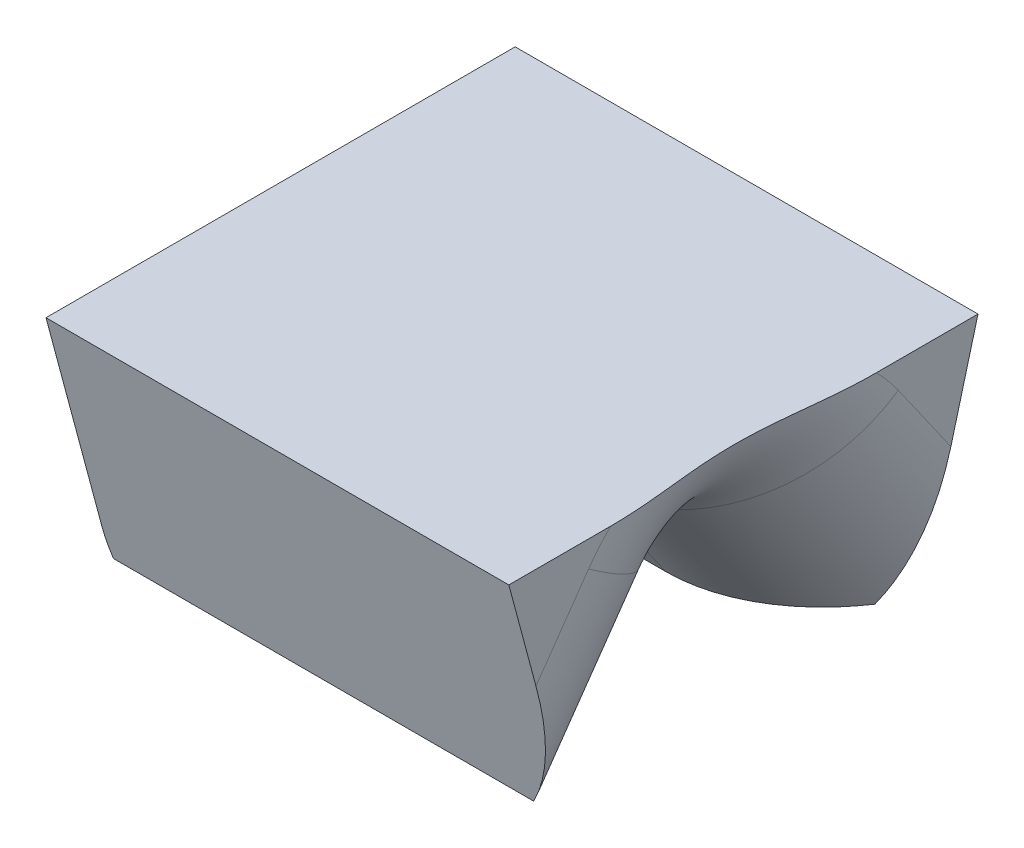
ISO-10303-21;
HEADER;
FILE_DESCRIPTION(('STEP AP214'),'2;1');
FILE_NAME('part.step','',(''),(''),'','','');
FILE_SCHEMA(('AUTOMOTIVE_DESIGN { 1 0 10303 214 1 1 1 1 }'));
ENDSEC;
DATA;
#1=APPLICATION_CONTEXT('core data for automotive mechanical design processes');
#2=APPLICATION_PROTOCOL_DEFINITION('international standard','automotive_design',2000,#1);
#3=PRODUCT_CONTEXT('',#1,'mechanical');
#4=PRODUCT('Part','Part','',(#3));
#5=PRODUCT_RELATED_PRODUCT_CATEGORY('part','',(#4));
#6=PRODUCT_DEFINITION_FORMATION('','',#4);
#7=PRODUCT_DEFINITION_CONTEXT('part definition',#1,'design');
#8=PRODUCT_DEFINITION('design','',#6,#7);
#9=PRODUCT_DEFINITION_SHAPE('','',#8);
#10=(LENGTH_UNIT() NAMED_UNIT(*) SI_UNIT(.MILLI.,.METRE.));
#11=(NAMED_UNIT(*) PLANE_ANGLE_UNIT() SI_UNIT($,.RADIAN.));
#12=(NAMED_UNIT(*) SI_UNIT($,.STERADIAN.) SOLID_ANGLE_UNIT());
#13=UNCERTAINTY_MEASURE_WITH_UNIT(LENGTH_MEASURE(1.E-05),#10,'distance_accuracy_value','');
#14=(GEOMETRIC_REPRESENTATION_CONTEXT(3) GLOBAL_UNCERTAINTY_ASSIGNED_CONTEXT((#13)) GLOBAL_UNIT_ASSIGNED_CONTEXT((#10,
#11,#12)) REPRESENTATION_CONTEXT('',''));
#15=CARTESIAN_POINT('',(0.,0.,0.));
#16=DIRECTION('',(0.,0.,1.));
#17=DIRECTION('',(1.,0.,0.));
#18=AXIS2_PLACEMENT_3D('',#15,#16,#17);
#19=CARTESIAN_POINT('',(0.,0.27922650273224,0.));
#20=DIRECTION('',(0.,1.,0.));
#21=DIRECTION('',(0.,0.,1.));
#22=AXIS2_PLACEMENT_3D('',#19,#20,#21);
#23=PLANE('',#22);
#24=DIRECTION('',(0.,0.,-1.));
#25=VECTOR('',#24,1.);
#26=CARTESIAN_POINT('',(-0.26924,0.27922650273224,1.4986));
#27=LINE('',#26,#25);
#28=CARTESIAN_POINT('',(-0.26924,0.27922650273224,0.274208515912471));
#29=VERTEX_POINT('',#28);
#30=CARTESIAN_POINT('',(-0.26924,0.27922650273224,-0.274208515912471));
#31=VERTEX_POINT('',#30);
#32=EDGE_CURVE('E327',#29,#31,#27,.T.);
#33=ORIENTED_EDGE('',*,*,#32,.F.);
#34=DIRECTION('',(-1.,0.,0.));
#35=VECTOR('',#34,1.);
#36=CARTESIAN_POINT('',(1.4986,0.27922650273224,0.274208515912471));
#37=LINE('',#36,#35);
#38=CARTESIAN_POINT('',(0.27178,0.27922650273224,0.274208515912471));
#39=VERTEX_POINT('',#38);
#40=EDGE_CURVE('E148',#39,#29,#37,.T.);
#41=ORIENTED_EDGE('',*,*,#40,.F.);
#42=DIRECTION('',(0.,0.,1.));
#43=VECTOR('',#42,1.);
#44=CARTESIAN_POINT('',(0.27178,0.27922650273224,1.4986));
#45=LINE('',#44,#43);
#46=CARTESIAN_POINT('',(0.27178,0.27922650273224,0.155199306049195));
#47=VERTEX_POINT('',#46);
#48=EDGE_CURVE('E58',#47,#39,#45,.T.);
#49=ORIENTED_EDGE('',*,*,#48,.F.);
#50=CARTESIAN_POINT('',(0.261409572351437,0.27922650273224,0.));
#51=CARTESIAN_POINT('',(0.261411930949183,0.27922650273224,0.0134753644819062));
#52=CARTESIAN_POINT('',(0.262027307295171,0.27922650273224,0.0269505145516935));
#53=CARTESIAN_POINT('',(0.264057567430298,0.27922650273224,0.0538534476202388));
#54=CARTESIAN_POINT('',(0.265474106116057,0.27922650273224,0.0672810744988983));
#55=CARTESIAN_POINT('',(0.268240338738278,0.27922650273224,0.0941487064279613));
#56=CARTESIAN_POINT('',(0.269590011099996,0.27922650273224,0.107588714066585));
#57=CARTESIAN_POINT('',(0.271441531605455,0.27922650273224,0.134512755613001));
#58=CARTESIAN_POINT('',(0.27194515694217,0.27922650273224,0.147996637471236));
#59=CARTESIAN_POINT('',(0.271503832959947,0.27922650273224,0.175721675900549));
#60=CARTESIAN_POINT('',(0.270475650819152,0.27922650273224,0.189962685952789));
#61=CARTESIAN_POINT('',(0.266325341418143,0.27922650273224,0.218151310804776));
#62=CARTESIAN_POINT('',(0.263204202100015,0.27922650273224,0.232099060830347));
#63=CARTESIAN_POINT('',(0.254536947856463,0.27922650273224,0.259414949987794));
#64=CARTESIAN_POINT('',(0.248963643916857,0.27922650273224,0.272774687998595));
#65=CARTESIAN_POINT('',(0.235314978842799,0.27922650273224,0.298162295281189));
#66=CARTESIAN_POINT('',(0.227240952722872,0.27922650273224,0.310190870556834));
#67=CARTESIAN_POINT('',(0.20993544907511,0.27922650273224,0.330895602184589));
#68=CARTESIAN_POINT('',(0.200981041006737,0.27922650273224,0.33980349266405));
#69=CARTESIAN_POINT('',(0.181539173886592,0.27922650273224,0.355751681174934));
#70=CARTESIAN_POINT('',(0.17105278481687,0.27922650273224,0.362793273104145));
#71=CARTESIAN_POINT('',(0.150166130211165,0.27922650273224,0.374010337046365));
#72=CARTESIAN_POINT('',(0.139891251488478,0.27922650273224,0.378420442747476));
#73=CARTESIAN_POINT('',(0.118724705510833,0.27922650273224,0.385355795227373));
#74=CARTESIAN_POINT('',(0.107833287617908,0.27922650273224,0.387881798262052));
#75=CARTESIAN_POINT('',(0.0862991296442801,0.27922650273224,0.390879748600226));
#76=CARTESIAN_POINT('',(0.075669039191837,0.27922650273224,0.391443305344718));
#77=CARTESIAN_POINT('',(0.0544687943929551,0.27922650273224,0.390753614920567));
#78=CARTESIAN_POINT('',(0.0438986319720614,0.27922650273224,0.389500618642163));
#79=CARTESIAN_POINT('',(0.0232516610462377,0.27922650273224,0.38524877198694));
#80=CARTESIAN_POINT('',(0.0131704011658055,0.27922650273224,0.382271450737142));
#81=CARTESIAN_POINT('',(-0.00636021819474013,0.27922650273224,0.374689363480222));
#82=CARTESIAN_POINT('',(-0.0158095000652034,0.27922650273224,0.37008439802612));
#83=CARTESIAN_POINT('',(-0.0339634800100927,0.27922650273224,0.359321713112478));
#84=CARTESIAN_POINT('',(-0.0426553071947941,0.27922650273224,0.353142324836664));
#85=CARTESIAN_POINT('',(-0.0589282425524156,0.27922650273224,0.339471053681931));
#86=CARTESIAN_POINT('',(-0.0665096354686949,0.27922650273224,0.331979508358927));
#87=CARTESIAN_POINT('',(-0.0807221919951382,0.27922650273224,0.31556142869167));
#88=CARTESIAN_POINT('',(-0.0872972457378956,0.27922650273224,0.306586440270441));
#89=CARTESIAN_POINT('',(-0.0989936649155186,0.27922650273224,0.287725201647558));
#90=CARTESIAN_POINT('',(-0.104113100837212,0.27922650273224,0.277837764708165));
#91=CARTESIAN_POINT('',(-0.113270204453259,0.27922650273224,0.256510438792003));
#92=CARTESIAN_POINT('',(-0.117168319195871,0.27922650273224,0.245011001006073));
#93=CARTESIAN_POINT('',(-0.12329254639139,0.27922650273224,0.221616753734351));
#94=CARTESIAN_POINT('',(-0.125522593207607,0.27922650273224,0.209722944133195));
#95=CARTESIAN_POINT('',(-0.129210284685769,0.27922650273224,0.180221206875491));
#96=CARTESIAN_POINT('',(-0.129834648420498,0.27922650273224,0.162512840460841));
#97=CARTESIAN_POINT('',(-0.129201469472564,0.27922650273224,0.135996767573505));
#98=CARTESIAN_POINT('',(-0.128725778663324,0.27922650273224,0.127144864414392));
#99=CARTESIAN_POINT('',(-0.127436113338908,0.27922650273224,0.109457033119701));
#100=CARTESIAN_POINT('',(-0.126621850882479,0.27922650273224,0.100621125026812));
#101=CARTESIAN_POINT('',(-0.124231375169854,0.27922650273224,0.0766042755949413));
#102=CARTESIAN_POINT('',(-0.122528834928036,0.27922650273224,0.0614379912442762));
#103=CARTESIAN_POINT('',(-0.120009195350884,0.27922650273224,0.0310530532246932));
#104=CARTESIAN_POINT('',(-0.119189571194242,0.27922650273224,0.0158346744015781));
#105=CARTESIAN_POINT('',(-0.119150360222816,0.27922650273224,-0.0146185128984737));
#106=CARTESIAN_POINT('',(-0.119932210971695,0.27922650273224,-0.029853323856607));
#107=CARTESIAN_POINT('',(-0.122409653985377,0.27922650273224,-0.0602703505226533));
#108=CARTESIAN_POINT('',(-0.124107948176397,0.27922650273224,-0.0754522764227972));
#109=CARTESIAN_POINT('',(-0.126608765883377,0.27922650273224,-0.10043719682521));
#110=CARTESIAN_POINT('',(-0.127514768409142,0.27922650273224,-0.110227874280489));
#111=CARTESIAN_POINT('',(-0.128894532085198,0.27922650273224,-0.129828761198234));
#112=CARTESIAN_POINT('',(-0.12936870673535,0.27922650273224,-0.13963894294179));
#113=CARTESIAN_POINT('',(-0.1297618775454,0.27922650273224,-0.168986125065657));
#114=CARTESIAN_POINT('',(-0.128672257039444,0.27922650273224,-0.188574929182217));
#115=CARTESIAN_POINT('',(-0.123487929944756,0.27922650273224,-0.220851759632217));
#116=CARTESIAN_POINT('',(-0.12048708496115,0.27922650273224,-0.233710139941791));
#117=CARTESIAN_POINT('',(-0.112444004684893,0.27922650273224,-0.258838884143882));
#118=CARTESIAN_POINT('',(-0.107394503560604,0.27922650273224,-0.271106979447686));
#119=CARTESIAN_POINT('',(-0.0951516806642721,0.27922650273224,-0.294636339464564));
#120=CARTESIAN_POINT('',(-0.0879447575358083,0.27922650273224,-0.305890608824321));
#121=CARTESIAN_POINT('',(-0.0715185428454595,0.27922650273224,-0.326800706223305));
#122=CARTESIAN_POINT('',(-0.0623031553416292,0.27922650273224,-0.336459572258379));
#123=CARTESIAN_POINT('',(-0.0432823795095371,0.27922650273224,-0.352749771517368));
#124=CARTESIAN_POINT('',(-0.0336649299595167,0.27922650273224,-0.359600996185923));
#125=CARTESIAN_POINT('',(-0.0133360672015722,0.27922650273224,-0.37143432797485));
#126=CARTESIAN_POINT('',(-0.00262473267847953,0.27922650273224,-0.376416569413755));
#127=CARTESIAN_POINT('',(0.0186753189022551,0.27922650273224,-0.383994619891665));
#128=CARTESIAN_POINT('',(0.0292090941962937,0.27922650273224,-0.386745567894979));
#129=CARTESIAN_POINT('',(0.0505921742493299,0.27922650273224,-0.390378315144707));
#130=CARTESIAN_POINT('',(0.0614413582505349,0.27922650273224,-0.391260820435553));
#131=CARTESIAN_POINT('',(0.0827981393330838,0.27922650273224,-0.391127595715074));
#132=CARTESIAN_POINT('',(0.0933061408666186,0.27922650273224,-0.390168484876454));
#133=CARTESIAN_POINT('',(0.114011017765888,0.27922650273224,-0.386497343057953));
#134=CARTESIAN_POINT('',(0.124207894552834,0.27922650273224,-0.383785320086601));
#135=CARTESIAN_POINT('',(0.143998981119113,0.27922650273224,-0.376704422285208));
#136=CARTESIAN_POINT('',(0.153593639498437,0.27922650273224,-0.372336798224142));
#137=CARTESIAN_POINT('',(0.17193706242015,0.27922650273224,-0.362091834024821));
#138=CARTESIAN_POINT('',(0.180685840069873,0.27922650273224,-0.356214517285149));
#139=CARTESIAN_POINT('',(0.197344387536552,0.27922650273224,-0.342969775419285));
#140=CARTESIAN_POINT('',(0.205226543648451,0.27922650273224,-0.335567685622365));
#141=CARTESIAN_POINT('',(0.219720673187446,0.27922650273224,-0.319610374962858));
#142=CARTESIAN_POINT('',(0.226332159408797,0.27922650273224,-0.3110547139239));
#143=CARTESIAN_POINT('',(0.238543396900728,0.27922650273224,-0.292500444172474));
#144=CARTESIAN_POINT('',(0.244057895640052,0.27922650273224,-0.282445888419424));
#145=CARTESIAN_POINT('',(0.253515115936898,0.27922650273224,-0.261638305410444));
#146=CARTESIAN_POINT('',(0.257458503153779,0.27922650273224,-0.250885576211995));
#147=CARTESIAN_POINT('',(0.265267128069491,0.27922650273224,-0.224021519997242));
#148=CARTESIAN_POINT('',(0.26830462447627,0.27922650273224,-0.207669169287877));
#149=CARTESIAN_POINT('',(0.271716061109982,0.27922650273224,-0.174670700789146));
#150=CARTESIAN_POINT('',(0.272078934355691,0.27922650273224,-0.158023647795927));
#151=CARTESIAN_POINT('',(0.271185334490767,0.27922650273224,-0.129577259993204));
#152=CARTESIAN_POINT('',(0.2703629567588,0.27922650273224,-0.117755275791181));
#153=CARTESIAN_POINT('',(0.268277633349044,0.27922650273224,-0.0941386140481303));
#154=CARTESIAN_POINT('',(0.267014098880695,0.27922650273224,-0.0823439943129568));
#155=CARTESIAN_POINT('',(0.264613296440676,0.27922650273224,-0.0588048320739451));
#156=CARTESIAN_POINT('',(0.263475382335501,0.27922650273224,-0.0470603638673561));
#157=CARTESIAN_POINT('',(0.261873271464089,0.27922650273224,-0.0235437905292073));
#158=CARTESIAN_POINT('',(0.261407511926821,0.27922650273224,-0.0117718134510921));
#159=CARTESIAN_POINT('',(0.261409572351437,0.27922650273224,0.));
#160=B_SPLINE_CURVE_WITH_KNOTS('',3,(#50,#51,#52,#53,#54,#55,#56,#57,#58,#59,#60,#61,#62,#63,
#64,#65,#66,#67,#68,#69,#70,#71,#72,#73,#74,#75,#76,#77,#78,#79,#80,#81,#82,#83,#84,#85,#86,#87,
#88,#89,#90,#91,#92,#93,#94,#95,#96,#97,#98,#99,#100,#101,#102,#103,#104,#105,#106,#107,#108,
#109,#110,#111,#112,#113,#114,#115,#116,#117,#118,#119,#120,#121,#122,#123,#124,#125,#126,#127,
#128,#129,#130,#131,#132,#133,#134,#135,#136,#137,#138,#139,#140,#141,#142,#143,#144,#145,#146,
#147,#148,#149,#150,#151,#152,#153,#154,#155,#156,#157,#158,#159),.UNSPECIFIED.,.T.,.F.,(4,2,2,
2,2,2,2,2,2,2,2,2,2,2,2,2,2,2,2,2,2,2,2,2,2,2,2,2,2,2,2,2,2,2,2,2,2,2,2,2,2,2,2,2,2,2,2,2,2,2,2,
2,2,2,4),(0.,0.0404210036662082,0.080925808297917,0.1214435980047,0.161876169768269,
0.204587290655132,0.247278264718459,0.290455007532691,0.333608739988325,0.371284004450668,
0.408933080059908,0.442307778834236,0.475669074190757,0.50745046849923,0.539227473790726,
0.570616026664885,0.60200842713893,0.633858718476046,0.665700828242473,0.698936544832523,
0.73221611422796,0.768502900810188,0.804703827865885,0.857635218077114,0.884227474136462,
0.910842392222406,0.956630669317037,1.00228765800492,1.04798564864093,1.09381911150299,
1.12330957086767,1.15277176164969,1.21128802125955,1.25075313427605,1.29035945647933,
1.33022093051515,1.37000560199431,1.40524130201511,1.44047446926057,1.4729745544678,
1.5054623563963,1.53696731246435,1.56847212459674,1.59995318284348,1.6314337531977,
1.66373002682763,1.69603865903733,1.73029916057309,1.7645451309075,1.81414539800468,
1.8639507850931,1.89948911304643,1.93507505475263,1.97046847240188,2.00577946642385),.UNSPECIFIED.);
#161=CARTESIAN_POINT('',(0.27178,0.27922650273224,-0.155199306049195));
#162=VERTEX_POINT('',#161);
#163=EDGE_CURVE('E12',#162,#47,#160,.T.);
#164=ORIENTED_EDGE('',*,*,#163,.F.);
#165=CARTESIAN_POINT('',(0.27178,0.27922650273224,-0.274208515912471));
#166=VERTEX_POINT('',#165);
#167=EDGE_CURVE('E135',#166,#162,#45,.T.);
#168=ORIENTED_EDGE('',*,*,#167,.F.);
#169=DIRECTION('',(1.,0.,0.));
#170=VECTOR('',#169,1.);
#171=CARTESIAN_POINT('',(1.4986,0.27922650273224,-0.274208515912471));
#172=LINE('',#171,#170);
#173=EDGE_CURVE('E330',#31,#166,#172,.T.);
#174=ORIENTED_EDGE('',*,*,#173,.F.);
#175=EDGE_LOOP('',(#33,#41,#49,#164,#168,#174));
#176=FACE_BOUND('',#175,.T.);
#177=ADVANCED_FACE('F39',(#176),#23,.T.);
#178=CARTESIAN_POINT('',(1.4986,0.,-0.19939));
#179=DIRECTION('',(0.,-0.258819045102522,-0.965925826289068));
#180=DIRECTION('',(0.,0.965925826289068,-0.258819045102522));
#181=AXIS2_PLACEMENT_3D('',#178,#179,#180);
#182=PLANE('',#181);
#183=DIRECTION('',(0.,0.965925826289068,-0.258819045102522));
#184=VECTOR('',#183,1.);
#185=CARTESIAN_POINT('',(-0.26924,0.,-0.19939));
#186=LINE('',#185,#184);
#187=CARTESIAN_POINT('',(-0.26924,0.035961265173748,-0.209025791962107));
#188=VERTEX_POINT('',#187);
#189=EDGE_CURVE('E257',#188,#31,#186,.T.);
#190=ORIENTED_EDGE('',*,*,#189,.T.);
#191=ORIENTED_EDGE('',*,*,#173,.T.);
#192=DIRECTION('',(0.,-0.965925826289068,0.258819045102522));
#193=VECTOR('',#192,1.);
#194=CARTESIAN_POINT('',(0.27178,0.,-0.19939));
#195=LINE('',#194,#193);
#196=CARTESIAN_POINT('',(0.27178,0.160868655615237,-0.242494626359583));
#197=VERTEX_POINT('',#196);
#198=EDGE_CURVE('E147',#166,#197,#195,.T.);
#199=ORIENTED_EDGE('',*,*,#198,.T.);
#200=CARTESIAN_POINT('',(0.07112,0.160868655615237,-0.242494626359583));
#201=DIRECTION('',(0.,-0.258819045102522,-0.965925826289068));
#202=DIRECTION('',(0.,-0.965925826289068,0.258819045102522));
#203=AXIS2_PLACEMENT_3D('',#200,#201,#202);
#204=ELLIPSE('',#203,0.261943026677416,0.20066);
#205=CARTESIAN_POINT('',(0.226000122767599,0.,-0.19939));
#206=VERTEX_POINT('',#205);
#207=EDGE_CURVE('E65',#197,#206,#204,.T.);
#208=ORIENTED_EDGE('',*,*,#207,.T.);
#209=DIRECTION('',(-1.,0.,0.));
#210=VECTOR('',#209,1.);
#211=CARTESIAN_POINT('',(1.4986,0.,-0.19939));
#212=LINE('',#211,#210);
#213=CARTESIAN_POINT('',(-0.265155055093439,0.,-0.19939));
#214=VERTEX_POINT('',#213);
#215=EDGE_CURVE('E262',#206,#214,#212,.T.);
#216=ORIENTED_EDGE('',*,*,#215,.T.);
#217=CARTESIAN_POINT('',(-0.16764,0.035961265173748,-0.209025791962107));
#218=DIRECTION('',(0.,-0.258819045102522,-0.965925826289068));
#219=DIRECTION('',(0.,0.965925826289068,-0.258819045102522));
#220=AXIS2_PLACEMENT_3D('',#217,#218,#219);
#221=ELLIPSE('',#220,0.13262938059616,0.1016);
#222=EDGE_CURVE('E301',#214,#188,#221,.T.);
#223=ORIENTED_EDGE('',*,*,#222,.T.);
#224=EDGE_LOOP('',(#190,#191,#199,#208,#216,#223));
#225=FACE_BOUND('',#224,.T.);
#226=ADVANCED_FACE('F199',(#225),#182,.T.);
#227=CARTESIAN_POINT('',(1.4986,0.,0.19939));
#228=DIRECTION('',(0.,-0.258819045102522,0.965925826289068));
#229=DIRECTION('',(0.,-0.965925826289068,-0.258819045102522));
#230=AXIS2_PLACEMENT_3D('',#227,#228,#229);
#231=PLANE('',#230);
#232=DIRECTION('',(0.,0.965925826289068,0.258819045102522));
#233=VECTOR('',#232,1.);
#234=CARTESIAN_POINT('',(0.27178,0.,0.19939));
#235=LINE('',#234,#233);
#236=CARTESIAN_POINT('',(0.27178,0.160868655615237,0.242494626359583));
#237=VERTEX_POINT('',#236);
#238=EDGE_CURVE('E247',#237,#39,#235,.T.);
#239=ORIENTED_EDGE('',*,*,#238,.T.);
#240=ORIENTED_EDGE('',*,*,#40,.T.);
#241=DIRECTION('',(0.,-0.965925826289068,-0.258819045102522));
#242=VECTOR('',#241,1.);
#243=CARTESIAN_POINT('',(-0.26924,0.,0.19939));
#244=LINE('',#243,#242);
#245=CARTESIAN_POINT('',(-0.26924,0.035961265173748,0.209025791962107));
#246=VERTEX_POINT('',#245);
#247=EDGE_CURVE('E263',#29,#246,#244,.T.);
#248=ORIENTED_EDGE('',*,*,#247,.T.);
#249=CARTESIAN_POINT('',(-0.16764,0.035961265173748,0.209025791962107));
#250=DIRECTION('',(0.,-0.258819045102522,0.965925826289068));
#251=DIRECTION('',(0.,-0.965925826289068,-0.258819045102522));
#252=AXIS2_PLACEMENT_3D('',#249,#250,#251);
#253=ELLIPSE('',#252,0.13262938059616,0.1016);
#254=CARTESIAN_POINT('',(-0.265155055093439,0.,0.19939));
#255=VERTEX_POINT('',#254);
#256=EDGE_CURVE('E287',#246,#255,#253,.T.);
#257=ORIENTED_EDGE('',*,*,#256,.T.);
#258=DIRECTION('',(-1.,0.,0.));
#259=VECTOR('',#258,1.);
#260=CARTESIAN_POINT('',(1.4986,0.,0.19939));
#261=LINE('',#260,#259);
#262=CARTESIAN_POINT('',(0.226000122767599,0.,0.19939));
#263=VERTEX_POINT('',#262);
#264=EDGE_CURVE('E260',#263,#255,#261,.T.);
#265=ORIENTED_EDGE('',*,*,#264,.F.);
#266=CARTESIAN_POINT('',(0.07112,0.160868655615237,0.242494626359583));
#267=DIRECTION('',(0.,-0.258819045102522,0.965925826289068));
#268=DIRECTION('',(0.,0.965925826289068,0.258819045102522));
#269=AXIS2_PLACEMENT_3D('',#266,#267,#268);
#270=ELLIPSE('',#269,0.261943026677416,0.20066);
#271=EDGE_CURVE('E159',#263,#237,#270,.T.);
#272=ORIENTED_EDGE('',*,*,#271,.T.);
#273=EDGE_LOOP('',(#239,#240,#248,#257,#265,#272));
#274=FACE_BOUND('',#273,.T.);
#275=ADVANCED_FACE('F231',(#274),#231,.T.);
#276=CARTESIAN_POINT('',(-0.26924,0.82312002,1.4986));
#277=DIRECTION('',(-1.,0.,0.));
#278=DIRECTION('',(0.,-1.,0.));
#279=AXIS2_PLACEMENT_3D('',#276,#277,#278);
#280=PLANE('',#279);
#281=ORIENTED_EDGE('',*,*,#247,.F.);
#282=ORIENTED_EDGE('',*,*,#32,.T.);
#283=ORIENTED_EDGE('',*,*,#189,.F.);
#284=DIRECTION('',(0.,-0.819152044288993,-0.573576436351044));
#285=VECTOR('',#284,1.);
#286=CARTESIAN_POINT('',(-0.26924,0.191850439119919,-0.0998710172397141));
#287=LINE('',#286,#285);
#288=CARTESIAN_POINT('',(-0.26924,0.191850439119919,-0.0998710172397141));
#289=VERTEX_POINT('',#288);
#290=EDGE_CURVE('E273',#188,#289,#287,.F.);
#291=ORIENTED_EDGE('',*,*,#290,.T.);
#292=CARTESIAN_POINT('',(-0.26924,0.12192,0.));
#293=DIRECTION('',(-1.,0.,0.));
#294=DIRECTION('',(0.,-1.,0.));
#295=AXIS2_PLACEMENT_3D('',#292,#293,#294);
#296=CIRCLE('',#295,0.12192);
#297=CARTESIAN_POINT('',(-0.26924,0.191850439119919,0.0998710172397142));
#298=VERTEX_POINT('',#297);
#299=EDGE_CURVE('E279',#289,#298,#296,.F.);
#300=ORIENTED_EDGE('',*,*,#299,.T.);
#301=DIRECTION('',(0.,0.819152044288994,-0.573576436351044));
#302=VECTOR('',#301,1.);
#303=CARTESIAN_POINT('',(-0.26924,0.0582753659332659,0.193401290401922));
#304=LINE('',#303,#302);
#305=EDGE_CURVE('E285',#298,#246,#304,.F.);
#306=ORIENTED_EDGE('',*,*,#305,.T.);
#307=EDGE_LOOP('',(#281,#282,#283,#291,#300,#306));
#308=FACE_BOUND('',#307,.T.);
#309=ADVANCED_FACE('F352',(#308),#280,.T.);
#310=CARTESIAN_POINT('',(0.27178,-0.00999998,1.4986));
#311=DIRECTION('',(1.,0.,0.));
#312=DIRECTION('',(0.,0.,-1.));
#313=AXIS2_PLACEMENT_3D('',#310,#311,#312);
#314=PLANE('',#313);
#315=ORIENTED_EDGE('',*,*,#198,.F.);
#316=ORIENTED_EDGE('',*,*,#167,.T.);
#317=CARTESIAN_POINT('',(0.27178,0.12192,0.));
#318=DIRECTION('',(1.,0.,0.));
#319=DIRECTION('',(0.,0.,-1.));
#320=AXIS2_PLACEMENT_3D('',#317,#318,#319);
#321=CIRCLE('',#320,0.22098);
#322=CARTESIAN_POINT('',(0.27178,0.248668920904854,-0.181016218746982));
#323=VERTEX_POINT('',#322);
#324=EDGE_CURVE('E145',#162,#323,#321,.F.);
#325=ORIENTED_EDGE('',*,*,#324,.T.);
#326=DIRECTION('',(0.,0.819152044288994,0.573576436351044));
#327=VECTOR('',#326,1.);
#328=CARTESIAN_POINT('',(0.27178,0.1150938477182,-0.274546491909189));
#329=LINE('',#328,#327);
#330=EDGE_CURVE('E156',#323,#197,#329,.F.);
#331=ORIENTED_EDGE('',*,*,#330,.T.);
#332=EDGE_LOOP('',(#315,#316,#325,#331));
#333=FACE_BOUND('',#332,.T.);
#334=ADVANCED_FACE('F143',(#333),#314,.T.);
#335=CARTESIAN_POINT('',(0.27178,0.248668920904854,0.181016218746982));
#336=VERTEX_POINT('',#335);
#337=EDGE_CURVE('E155',#336,#47,#321,.F.);
#338=ORIENTED_EDGE('',*,*,#337,.T.);
#339=ORIENTED_EDGE('',*,*,#48,.T.);
#340=ORIENTED_EDGE('',*,*,#238,.F.);
#341=DIRECTION('',(0.,-0.819152044288994,0.573576436351043));
#342=VECTOR('',#341,1.);
#343=CARTESIAN_POINT('',(0.27178,0.248668920904853,0.181016218746982));
#344=LINE('',#343,#342);
#345=EDGE_CURVE('E158',#237,#336,#344,.F.);
#346=ORIENTED_EDGE('',*,*,#345,.T.);
#347=EDGE_LOOP('',(#338,#339,#340,#346));
#348=FACE_BOUND('',#347,.T.);
#349=ADVANCED_FACE('F220',(#348),#314,.T.);
#350=CARTESIAN_POINT('',(0.07112,0.12192,0.));
#351=DIRECTION('',(1.,0.,0.));
#352=DIRECTION('',(0.,0.,-1.));
#353=AXIS2_PLACEMENT_3D('',#350,#351,#352);
#354=TOROIDAL_SURFACE('',#353,0.22098,0.20066);
#355=ORIENTED_EDGE('',*,*,#324,.F.);
#356=ORIENTED_EDGE('',*,*,#163,.T.);
#357=ORIENTED_EDGE('',*,*,#337,.F.);
#358=CARTESIAN_POINT('',(0.0711200000000007,0.248668920904854,0.181016218746982));
#359=DIRECTION('',(0.,-0.819152044288993,0.573576436351045));
#360=DIRECTION('',(0.,-0.573576436351045,-0.819152044288993));
#361=AXIS2_PLACEMENT_3D('',#358,#359,#360);
#362=CIRCLE('',#361,0.20066);
#363=CARTESIAN_POINT('',(0.0711200000000007,0.133575073186653,0.0166451695399524));
#364=VERTEX_POINT('',#363);
#365=EDGE_CURVE('E326',#364,#336,#362,.T.);
#366=ORIENTED_EDGE('',*,*,#365,.F.);
#367=CARTESIAN_POINT('',(0.0711200000000007,0.12192,0.));
#368=DIRECTION('',(1.,0.,0.));
#369=DIRECTION('',(0.,0.,-1.));
#370=AXIS2_PLACEMENT_3D('',#367,#368,#369);
#371=CIRCLE('',#370,0.0203200000000001);
#372=CARTESIAN_POINT('',(0.07112,0.133575073186653,-0.0166451695399524));
#373=VERTEX_POINT('',#372);
#374=EDGE_CURVE('E164',#373,#364,#371,.T.);
#375=ORIENTED_EDGE('',*,*,#374,.F.);
#376=CARTESIAN_POINT('',(0.07112,0.248668920904854,-0.181016218746982));
#377=DIRECTION('',(0.,0.819152044288993,0.573576436351044));
#378=DIRECTION('',(0.,-0.573576436351044,0.819152044288993));
#379=AXIS2_PLACEMENT_3D('',#376,#377,#378);
#380=CIRCLE('',#379,0.20066);
#381=EDGE_CURVE('E154',#373,#323,#380,.T.);
#382=ORIENTED_EDGE('',*,*,#381,.T.);
#383=EDGE_LOOP('',(#355,#356,#357,#366,#375,#382));
#384=FACE_BOUND('',#383,.T.);
#385=ADVANCED_FACE('F151',(#384),#354,.T.);
#386=CARTESIAN_POINT('',(0.,0.,0.));
#387=DIRECTION('',(0.,1.,0.));
#388=DIRECTION('',(0.,0.,1.));
#389=AXIS2_PLACEMENT_3D('',#386,#387,#388);
#390=PLANE('',#389);
#391=ORIENTED_EDGE('',*,*,#215,.F.);
#392=CARTESIAN_POINT('',(0.07112,0.,-0.355136071683033));
#393=DIRECTION('',(0.,1.,0.));
#394=DIRECTION('',(0.,0.,-1.));
#395=AXIS2_PLACEMENT_3D('',#392,#393,#394);
#396=ELLIPSE('',#395,0.244960628980873,0.20066);
#397=CARTESIAN_POINT('',(0.07112,0.,-0.11017544270216));
#398=VERTEX_POINT('',#397);
#399=EDGE_CURVE('E51',#206,#398,#396,.F.);
#400=ORIENTED_EDGE('',*,*,#399,.T.);
#401=CARTESIAN_POINT('',(0.07112,0.,-0.11017544270216));
#402=DIRECTION('',(-1.,0.,0.));
#403=VECTOR('',#402,1.);
#404=LINE('',#401,#403);
#405=CARTESIAN_POINT('',(-0.16764,0.,-0.11017544270216));
#406=VERTEX_POINT('',#405);
#407=EDGE_CURVE('E172',#398,#406,#404,.T.);
#408=ORIENTED_EDGE('',*,*,#407,.T.);
#409=CARTESIAN_POINT('',(-0.16764,0.,-0.234206140920324));
#410=DIRECTION('',(0.,1.,0.));
#411=DIRECTION('',(0.,0.,1.));
#412=AXIS2_PLACEMENT_3D('',#409,#410,#411);
#413=ELLIPSE('',#412,0.124030698218164,0.1016);
#414=EDGE_CURVE('E297',#406,#214,#413,.F.);
#415=ORIENTED_EDGE('',*,*,#414,.T.);
#416=EDGE_LOOP('',(#391,#400,#408,#415));
#417=FACE_BOUND('',#416,.T.);
#418=ADVANCED_FACE('F197',(#417),#390,.F.);
#419=CARTESIAN_POINT('',(-0.16764,0.,0.11017544270216));
#420=DIRECTION('',(1.,0.,0.));
#421=VECTOR('',#420,1.);
#422=LINE('',#419,#421);
#423=CARTESIAN_POINT('',(-0.16764,0.,0.11017544270216));
#424=VERTEX_POINT('',#423);
#425=CARTESIAN_POINT('',(0.0711199999999997,0.,0.11017544270216));
#426=VERTEX_POINT('',#425);
#427=EDGE_CURVE('E264',#424,#426,#422,.T.);
#428=ORIENTED_EDGE('',*,*,#427,.T.);
#429=CARTESIAN_POINT('',(0.07112,0.,0.355136071683033));
#430=DIRECTION('',(0.,1.,0.));
#431=DIRECTION('',(0.,0.,-1.));
#432=AXIS2_PLACEMENT_3D('',#429,#430,#431);
#433=ELLIPSE('',#432,0.244960628980873,0.20066);
#434=EDGE_CURVE('E314',#426,#263,#433,.F.);
#435=ORIENTED_EDGE('',*,*,#434,.T.);
#436=ORIENTED_EDGE('',*,*,#264,.T.);
#437=CARTESIAN_POINT('',(-0.16764,0.,0.234206140920324));
#438=DIRECTION('',(0.,1.,0.));
#439=DIRECTION('',(0.,0.,1.));
#440=AXIS2_PLACEMENT_3D('',#437,#438,#439);
#441=ELLIPSE('',#440,0.124030698218164,0.1016);
#442=EDGE_CURVE('E289',#255,#424,#441,.F.);
#443=ORIENTED_EDGE('',*,*,#442,.T.);
#444=EDGE_LOOP('',(#428,#435,#436,#443));
#445=FACE_BOUND('',#444,.T.);
#446=ADVANCED_FACE('F186',(#445),#390,.F.);
#447=CARTESIAN_POINT('',(-1.20142,0.133575073186653,-0.0166451695399524));
#448=DIRECTION('',(0.,0.573576436351044,-0.819152044288993));
#449=DIRECTION('',(0.,0.819152044288993,0.573576436351044));
#450=AXIS2_PLACEMENT_3D('',#447,#448,#449);
#451=PLANE('',#450);
#452=ORIENTED_EDGE('',*,*,#407,.F.);
#453=DIRECTION('',(0.,0.819152044288993,0.573576436351044));
#454=VECTOR('',#453,1.);
#455=CARTESIAN_POINT('',(0.07112,0.133575073186653,-0.0166451695399523));
#456=LINE('',#455,#454);
#457=EDGE_CURVE('E166',#398,#373,#456,.T.);
#458=ORIENTED_EDGE('',*,*,#457,.T.);
#459=DIRECTION('',(1.,0.,0.));
#460=VECTOR('',#459,1.);
#461=CARTESIAN_POINT('',(-1.20142,0.133575073186653,-0.0166451695399524));
#462=LINE('',#461,#460);
#463=CARTESIAN_POINT('',(-0.16764,0.133575073186653,-0.0166451695399524));
#464=VERTEX_POINT('',#463);
#465=EDGE_CURVE('E311',#464,#373,#462,.T.);
#466=ORIENTED_EDGE('',*,*,#465,.F.);
#467=DIRECTION('',(0.,-0.819152044288993,-0.573576436351044));
#468=VECTOR('',#467,1.);
#469=CARTESIAN_POINT('',(-0.16764,0.,-0.11017544270216));
#470=LINE('',#469,#468);
#471=EDGE_CURVE('E295',#464,#406,#470,.T.);
#472=ORIENTED_EDGE('',*,*,#471,.T.);
#473=EDGE_LOOP('',(#452,#458,#466,#472));
#474=FACE_BOUND('',#473,.T.);
#475=ADVANCED_FACE('F196',(#474),#451,.F.);
#476=CARTESIAN_POINT('',(-1.20142,-0.00999998000000012,0.117177504080106));
#477=DIRECTION('',(0.,0.573576436351044,0.819152044288994));
#478=DIRECTION('',(0.,-0.819152044288994,0.573576436351044));
#479=AXIS2_PLACEMENT_3D('',#476,#477,#478);
#480=PLANE('',#479);
#481=DIRECTION('',(1.,0.,0.));
#482=VECTOR('',#481,1.);
#483=CARTESIAN_POINT('',(-1.20142,0.133575073186653,0.0166451695399524));
#484=LINE('',#483,#482);
#485=CARTESIAN_POINT('',(-0.16764,0.133575073186653,0.0166451695399524));
#486=VERTEX_POINT('',#485);
#487=EDGE_CURVE('E255',#486,#364,#484,.T.);
#488=ORIENTED_EDGE('',*,*,#487,.T.);
#489=DIRECTION('',(0.,-0.819152044288994,0.573576436351044));
#490=VECTOR('',#489,1.);
#491=CARTESIAN_POINT('',(0.07112,0.,0.11017544270216));
#492=LINE('',#491,#490);
#493=EDGE_CURVE('E305',#364,#426,#492,.T.);
#494=ORIENTED_EDGE('',*,*,#493,.T.);
#495=ORIENTED_EDGE('',*,*,#427,.F.);
#496=DIRECTION('',(0.,0.819152044288994,-0.573576436351044));
#497=VECTOR('',#496,1.);
#498=CARTESIAN_POINT('',(-0.16764,0.133575073186653,0.0166451695399525));
#499=LINE('',#498,#497);
#500=EDGE_CURVE('E271',#424,#486,#499,.T.);
#501=ORIENTED_EDGE('',*,*,#500,.T.);
#502=EDGE_LOOP('',(#488,#494,#495,#501));
#503=FACE_BOUND('',#502,.T.);
#504=ADVANCED_FACE('F237',(#503),#480,.F.);
#505=CARTESIAN_POINT('',(-1.20142,0.12192,0.));
#506=DIRECTION('',(1.,0.,0.));
#507=DIRECTION('',(0.,0.,-1.));
#508=AXIS2_PLACEMENT_3D('',#505,#506,#507);
#509=CYLINDRICAL_SURFACE('',#508,0.0203200000000001);
#510=ORIENTED_EDGE('',*,*,#465,.T.);
#511=ORIENTED_EDGE('',*,*,#374,.T.);
#512=ORIENTED_EDGE('',*,*,#487,.F.);
#513=CARTESIAN_POINT('',(-0.16764,0.12192,0.));
#514=DIRECTION('',(-1.,0.,0.));
#515=DIRECTION('',(0.,-1.,0.));
#516=AXIS2_PLACEMENT_3D('',#513,#514,#515);
#517=CIRCLE('',#516,0.0203200000000001);
#518=EDGE_CURVE('E291',#486,#464,#517,.T.);
#519=ORIENTED_EDGE('',*,*,#518,.T.);
#520=EDGE_LOOP('',(#510,#511,#512,#519));
#521=FACE_BOUND('',#520,.T.);
#522=ADVANCED_FACE('F213',(#521),#509,.F.);
#523=CARTESIAN_POINT('',(-0.16764,0.191850439119919,-0.0998710172397141));
#524=DIRECTION('',(0.,0.819152044288993,0.573576436351044));
#525=DIRECTION('',(0.,-0.573576436351044,0.819152044288993));
#526=AXIS2_PLACEMENT_3D('',#523,#524,#525);
#527=CYLINDRICAL_SURFACE('',#526,0.1016);
#528=ORIENTED_EDGE('',*,*,#414,.F.);
#529=ORIENTED_EDGE('',*,*,#471,.F.);
#530=CARTESIAN_POINT('',(-0.16764,0.191850439119919,-0.0998710172397141));
#531=DIRECTION('',(0.,0.819152044288993,0.573576436351045));
#532=DIRECTION('',(0.,-0.573576436351045,0.819152044288993));
#533=AXIS2_PLACEMENT_3D('',#530,#531,#532);
#534=CIRCLE('',#533,0.1016);
#535=EDGE_CURVE('E308',#289,#464,#534,.T.);
#536=ORIENTED_EDGE('',*,*,#535,.F.);
#537=ORIENTED_EDGE('',*,*,#290,.F.);
#538=ORIENTED_EDGE('',*,*,#222,.F.);
#539=EDGE_LOOP('',(#528,#529,#536,#537,#538));
#540=FACE_BOUND('',#539,.T.);
#541=ADVANCED_FACE('F209',(#540),#527,.T.);
#542=CARTESIAN_POINT('',(-0.16764,0.12192,0.));
#543=DIRECTION('',(-1.,0.,0.));
#544=DIRECTION('',(0.,-1.,0.));
#545=AXIS2_PLACEMENT_3D('',#542,#543,#544);
#546=TOROIDAL_SURFACE('',#545,0.12192,0.1016);
#547=ORIENTED_EDGE('',*,*,#535,.T.);
#548=ORIENTED_EDGE('',*,*,#518,.F.);
#549=CARTESIAN_POINT('',(-0.16764,0.191850439119919,0.0998710172397142));
#550=DIRECTION('',(0.,-0.819152044288994,0.573576436351043));
#551=DIRECTION('',(0.,-0.573576436351043,-0.819152044288994));
#552=AXIS2_PLACEMENT_3D('',#549,#550,#551);
#553=CIRCLE('',#552,0.1016);
#554=EDGE_CURVE('E306',#298,#486,#553,.T.);
#555=ORIENTED_EDGE('',*,*,#554,.F.);
#556=ORIENTED_EDGE('',*,*,#299,.F.);
#557=EDGE_LOOP('',(#547,#548,#555,#556));
#558=FACE_BOUND('',#557,.T.);
#559=ADVANCED_FACE('F205',(#558),#546,.T.);
#560=CARTESIAN_POINT('',(-0.16764,0.048275385933266,0.200403351779868));
#561=DIRECTION('',(0.,-0.819152044288994,0.573576436351044));
#562=DIRECTION('',(0.,-0.573576436351044,-0.819152044288994));
#563=AXIS2_PLACEMENT_3D('',#560,#561,#562);
#564=CYLINDRICAL_SURFACE('',#563,0.1016);
#565=ORIENTED_EDGE('',*,*,#256,.F.);
#566=ORIENTED_EDGE('',*,*,#305,.F.);
#567=ORIENTED_EDGE('',*,*,#554,.T.);
#568=ORIENTED_EDGE('',*,*,#500,.F.);
#569=ORIENTED_EDGE('',*,*,#442,.F.);
#570=EDGE_LOOP('',(#565,#566,#567,#568,#569));
#571=FACE_BOUND('',#570,.T.);
#572=ADVANCED_FACE('F201',(#571),#564,.T.);
#573=CARTESIAN_POINT('',(0.07112,0.248668920904854,-0.181016218746982));
#574=DIRECTION('',(0.,-0.819152044288994,-0.573576436351044));
#575=DIRECTION('',(0.,0.573576436351044,-0.819152044288994));
#576=AXIS2_PLACEMENT_3D('',#573,#574,#575);
#577=CYLINDRICAL_SURFACE('',#576,0.20066);
#578=ORIENTED_EDGE('',*,*,#207,.F.);
#579=ORIENTED_EDGE('',*,*,#330,.F.);
#580=ORIENTED_EDGE('',*,*,#381,.F.);
#581=ORIENTED_EDGE('',*,*,#457,.F.);
#582=ORIENTED_EDGE('',*,*,#399,.F.);
#583=EDGE_LOOP('',(#578,#579,#580,#581,#582));
#584=FACE_BOUND('',#583,.T.);
#585=ADVANCED_FACE('F41',(#584),#577,.T.);
#586=CARTESIAN_POINT('',(0.07112,0.1050938677182,0.281548553287136));
#587=DIRECTION('',(0.,0.819152044288994,-0.573576436351043));
#588=DIRECTION('',(0.,0.573576436351043,0.819152044288994));
#589=AXIS2_PLACEMENT_3D('',#586,#587,#588);
#590=CYLINDRICAL_SURFACE('',#589,0.20066);
#591=ORIENTED_EDGE('',*,*,#365,.T.);
#592=ORIENTED_EDGE('',*,*,#345,.F.);
#593=ORIENTED_EDGE('',*,*,#271,.F.);
#594=ORIENTED_EDGE('',*,*,#434,.F.);
#595=ORIENTED_EDGE('',*,*,#493,.F.);
#596=EDGE_LOOP('',(#591,#592,#593,#594,#595));
#597=FACE_BOUND('',#596,.T.);
#598=ADVANCED_FACE('F215',(#597),#590,.T.);
#599=CLOSED_SHELL('',(#177,#226,#275,#309,#334,#349,#385,#418,#446,#475,#504,#522,#541,#559,
#572,#585,#598));
#600=MANIFOLD_SOLID_BREP('B2',#599);
#601=ADVANCED_BREP_SHAPE_REPRESENTATION('',(#18,#600),#14);
#602=SHAPE_DEFINITION_REPRESENTATION(#9,#601);
ENDSEC;
END-ISO-10303-21;
